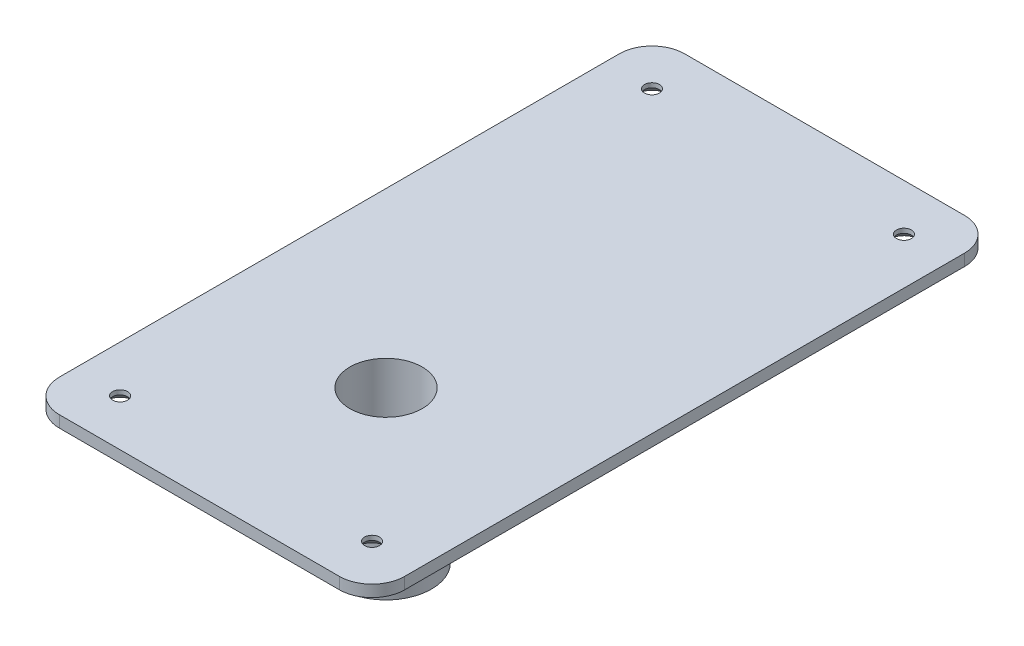
ISO-10303-21;
HEADER;
FILE_DESCRIPTION(('STEP AP214'),'2;1');
FILE_NAME('part.step','',(''),(''),'','','');
FILE_SCHEMA(('AUTOMOTIVE_DESIGN { 1 0 10303 214 1 1 1 1 }'));
ENDSEC;
DATA;
#1=APPLICATION_CONTEXT('core data for automotive mechanical design processes');
#2=APPLICATION_PROTOCOL_DEFINITION('international standard','automotive_design',2000,#1);
#3=PRODUCT_CONTEXT('',#1,'mechanical');
#4=PRODUCT('Part','Part','',(#3));
#5=PRODUCT_RELATED_PRODUCT_CATEGORY('part','',(#4));
#6=PRODUCT_DEFINITION_FORMATION('','',#4);
#7=PRODUCT_DEFINITION_CONTEXT('part definition',#1,'design');
#8=PRODUCT_DEFINITION('design','',#6,#7);
#9=PRODUCT_DEFINITION_SHAPE('','',#8);
#10=(LENGTH_UNIT() NAMED_UNIT(*) SI_UNIT(.MILLI.,.METRE.));
#11=(NAMED_UNIT(*) PLANE_ANGLE_UNIT() SI_UNIT($,.RADIAN.));
#12=(NAMED_UNIT(*) SI_UNIT($,.STERADIAN.) SOLID_ANGLE_UNIT());
#13=UNCERTAINTY_MEASURE_WITH_UNIT(LENGTH_MEASURE(1.E-05),#10,'distance_accuracy_value','');
#14=(GEOMETRIC_REPRESENTATION_CONTEXT(3) GLOBAL_UNCERTAINTY_ASSIGNED_CONTEXT((#13)) GLOBAL_UNIT_ASSIGNED_CONTEXT((#10,
#11,#12)) REPRESENTATION_CONTEXT('',''));
#15=CARTESIAN_POINT('',(0.,0.,0.));
#16=DIRECTION('',(0.,0.,1.));
#17=DIRECTION('',(1.,0.,0.));
#18=AXIS2_PLACEMENT_3D('',#15,#16,#17);
#19=CARTESIAN_POINT('',(-30.,2.5,-60.));
#20=DIRECTION('',(0.,1.,0.));
#21=DIRECTION('',(0.,0.,1.));
#22=AXIS2_PLACEMENT_3D('',#19,#20,#21);
#23=PLANE('',#22);
#24=CARTESIAN_POINT('',(-27.,2.5,57.));
#25=DIRECTION('',(0.,1.,0.));
#26=DIRECTION('',(0.,0.,1.));
#27=AXIS2_PLACEMENT_3D('',#24,#25,#26);
#28=CIRCLE('',#27,1.6);
#29=CARTESIAN_POINT('',(-27.,2.5,58.6));
#30=VERTEX_POINT('',#29);
#31=EDGE_CURVE('E268',#30,#30,#28,.F.);
#32=ORIENTED_EDGE('',*,*,#31,.T.);
#33=EDGE_LOOP('',(#32));
#34=FACE_BOUND('',#33,.T.);
#35=CARTESIAN_POINT('',(27.,2.5,-57.));
#36=DIRECTION('',(0.,1.,0.));
#37=DIRECTION('',(0.,0.,1.));
#38=AXIS2_PLACEMENT_3D('',#35,#36,#37);
#39=CIRCLE('',#38,1.6);
#40=CARTESIAN_POINT('',(27.,2.5,-55.4));
#41=VERTEX_POINT('',#40);
#42=EDGE_CURVE('E244',#41,#41,#39,.F.);
#43=ORIENTED_EDGE('',*,*,#42,.T.);
#44=EDGE_LOOP('',(#43));
#45=FACE_BOUND('',#44,.T.);
#46=CARTESIAN_POINT('',(-27.,2.5,-57.));
#47=DIRECTION('',(0.,1.,0.));
#48=DIRECTION('',(0.,0.,1.));
#49=AXIS2_PLACEMENT_3D('',#46,#47,#48);
#50=CIRCLE('',#49,1.6);
#51=CARTESIAN_POINT('',(-27.,2.5,-55.4));
#52=VERTEX_POINT('',#51);
#53=EDGE_CURVE('E231',#52,#52,#50,.F.);
#54=ORIENTED_EDGE('',*,*,#53,.T.);
#55=EDGE_LOOP('',(#54));
#56=FACE_BOUND('',#55,.T.);
#57=CARTESIAN_POINT('',(0.,2.5,27.));
#58=DIRECTION('',(0.,1.,0.));
#59=DIRECTION('',(0.,0.,1.));
#60=AXIS2_PLACEMENT_3D('',#57,#58,#59);
#61=CIRCLE('',#60,7.75);
#62=CARTESIAN_POINT('',(0.,2.5,34.75));
#63=VERTEX_POINT('',#62);
#64=EDGE_CURVE('E51',#63,#63,#61,.F.);
#65=ORIENTED_EDGE('',*,*,#64,.T.);
#66=EDGE_LOOP('',(#65));
#67=FACE_BOUND('',#66,.T.);
#68=CARTESIAN_POINT('',(-30.,2.5,-60.));
#69=DIRECTION('',(0.,1.,0.));
#70=DIRECTION('',(0.,0.,1.));
#71=AXIS2_PLACEMENT_3D('',#68,#69,#70);
#72=CIRCLE('',#71,6.99999999999999);
#73=CARTESIAN_POINT('',(-30.,2.5,-67.));
#74=VERTEX_POINT('',#73);
#75=CARTESIAN_POINT('',(-37.,2.5,-60.));
#76=VERTEX_POINT('',#75);
#77=EDGE_CURVE('E176',#74,#76,#72,.T.);
#78=ORIENTED_EDGE('',*,*,#77,.T.);
#79=DIRECTION('',(0.,0.,1.));
#80=VECTOR('',#79,1.);
#81=CARTESIAN_POINT('',(-37.,2.5,-60.));
#82=LINE('',#81,#80);
#83=CARTESIAN_POINT('',(-37.,2.5,60.));
#84=VERTEX_POINT('',#83);
#85=EDGE_CURVE('E104',#76,#84,#82,.T.);
#86=ORIENTED_EDGE('',*,*,#85,.T.);
#87=CARTESIAN_POINT('',(-30.,2.5,60.));
#88=DIRECTION('',(0.,1.,0.));
#89=DIRECTION('',(0.,0.,1.));
#90=AXIS2_PLACEMENT_3D('',#87,#88,#89);
#91=CIRCLE('',#90,7.);
#92=CARTESIAN_POINT('',(-30.,2.5,67.));
#93=VERTEX_POINT('',#92);
#94=EDGE_CURVE('E198',#84,#93,#91,.T.);
#95=ORIENTED_EDGE('',*,*,#94,.T.);
#96=DIRECTION('',(1.,0.,0.));
#97=VECTOR('',#96,1.);
#98=CARTESIAN_POINT('',(-30.,2.5,67.));
#99=LINE('',#98,#97);
#100=CARTESIAN_POINT('',(30.,2.5,67.));
#101=VERTEX_POINT('',#100);
#102=EDGE_CURVE('E210',#93,#101,#99,.T.);
#103=ORIENTED_EDGE('',*,*,#102,.T.);
#104=CARTESIAN_POINT('',(30.,2.5,60.));
#105=DIRECTION('',(0.,1.,0.));
#106=DIRECTION('',(0.,0.,1.));
#107=AXIS2_PLACEMENT_3D('',#104,#105,#106);
#108=CIRCLE('',#107,6.99999999999999);
#109=CARTESIAN_POINT('',(37.,2.5,60.));
#110=VERTEX_POINT('',#109);
#111=EDGE_CURVE('E138',#101,#110,#108,.T.);
#112=ORIENTED_EDGE('',*,*,#111,.T.);
#113=DIRECTION('',(0.,0.,1.));
#114=VECTOR('',#113,1.);
#115=CARTESIAN_POINT('',(37.,2.5,-60.));
#116=LINE('',#115,#114);
#117=CARTESIAN_POINT('',(37.,2.5,-60.));
#118=VERTEX_POINT('',#117);
#119=EDGE_CURVE('E123',#118,#110,#116,.T.);
#120=ORIENTED_EDGE('',*,*,#119,.F.);
#121=CARTESIAN_POINT('',(30.,2.5,-60.));
#122=DIRECTION('',(0.,-1.,0.));
#123=DIRECTION('',(0.,0.,-1.));
#124=AXIS2_PLACEMENT_3D('',#121,#122,#123);
#125=CIRCLE('',#124,7.);
#126=CARTESIAN_POINT('',(30.,2.5,-67.));
#127=VERTEX_POINT('',#126);
#128=EDGE_CURVE('E136',#127,#118,#125,.T.);
#129=ORIENTED_EDGE('',*,*,#128,.F.);
#130=DIRECTION('',(1.,0.,0.));
#131=VECTOR('',#130,1.);
#132=CARTESIAN_POINT('',(-30.,2.5,-67.));
#133=LINE('',#132,#131);
#134=EDGE_CURVE('E144',#74,#127,#133,.T.);
#135=ORIENTED_EDGE('',*,*,#134,.F.);
#136=EDGE_LOOP('',(#78,#86,#95,#103,#112,#120,#129,#135));
#137=FACE_BOUND('',#136,.T.);
#138=CARTESIAN_POINT('',(27.,2.5,57.));
#139=DIRECTION('',(0.,1.,0.));
#140=DIRECTION('',(0.,0.,1.));
#141=AXIS2_PLACEMENT_3D('',#138,#139,#140);
#142=CIRCLE('',#141,1.6);
#143=CARTESIAN_POINT('',(27.,2.5,58.6));
#144=VERTEX_POINT('',#143);
#145=EDGE_CURVE('E256',#144,#144,#142,.F.);
#146=ORIENTED_EDGE('',*,*,#145,.T.);
#147=EDGE_LOOP('',(#146));
#148=FACE_BOUND('',#147,.T.);
#149=ADVANCED_FACE('F47',(#34,#45,#56,#67,#137,#148),#23,.T.);
#150=CARTESIAN_POINT('',(-30.,2.5,-60.));
#151=DIRECTION('',(0.,-1.,0.));
#152=DIRECTION('',(0.,0.,-1.));
#153=AXIS2_PLACEMENT_3D('',#150,#151,#152);
#154=CYLINDRICAL_SURFACE('',#153,6.99999999999999);
#155=CARTESIAN_POINT('',(-30.,0.,-60.));
#156=DIRECTION('',(0.,1.,0.));
#157=DIRECTION('',(0.,0.,1.));
#158=AXIS2_PLACEMENT_3D('',#155,#156,#157);
#159=CIRCLE('',#158,6.99999999999999);
#160=CARTESIAN_POINT('',(-30.,0.,-67.));
#161=VERTEX_POINT('',#160);
#162=CARTESIAN_POINT('',(-37.,0.,-60.));
#163=VERTEX_POINT('',#162);
#164=EDGE_CURVE('E150',#161,#163,#159,.T.);
#165=ORIENTED_EDGE('',*,*,#164,.T.);
#166=DIRECTION('',(0.,-1.,0.));
#167=VECTOR('',#166,1.);
#168=CARTESIAN_POINT('',(-37.,2.5,-60.));
#169=LINE('',#168,#167);
#170=EDGE_CURVE('E12',#76,#163,#169,.T.);
#171=ORIENTED_EDGE('',*,*,#170,.F.);
#172=ORIENTED_EDGE('',*,*,#77,.F.);
#173=DIRECTION('',(0.,-1.,0.));
#174=VECTOR('',#173,1.);
#175=CARTESIAN_POINT('',(-30.,2.5,-67.));
#176=LINE('',#175,#174);
#177=EDGE_CURVE('E66',#74,#161,#176,.T.);
#178=ORIENTED_EDGE('',*,*,#177,.T.);
#179=EDGE_LOOP('',(#165,#171,#172,#178));
#180=FACE_BOUND('',#179,.T.);
#181=ADVANCED_FACE('F49',(#180),#154,.T.);
#182=CARTESIAN_POINT('',(-37.,2.5,-60.));
#183=DIRECTION('',(1.,0.,0.));
#184=DIRECTION('',(0.,0.,-1.));
#185=AXIS2_PLACEMENT_3D('',#182,#183,#184);
#186=PLANE('',#185);
#187=DIRECTION('',(0.,0.,1.));
#188=VECTOR('',#187,1.);
#189=CARTESIAN_POINT('',(-37.,0.,-60.));
#190=LINE('',#189,#188);
#191=CARTESIAN_POINT('',(-37.,0.,60.));
#192=VERTEX_POINT('',#191);
#193=EDGE_CURVE('E153',#163,#192,#190,.T.);
#194=ORIENTED_EDGE('',*,*,#193,.T.);
#195=DIRECTION('',(0.,-1.,0.));
#196=VECTOR('',#195,1.);
#197=CARTESIAN_POINT('',(-37.,2.5,60.));
#198=LINE('',#197,#196);
#199=EDGE_CURVE('E58',#84,#192,#198,.T.);
#200=ORIENTED_EDGE('',*,*,#199,.F.);
#201=ORIENTED_EDGE('',*,*,#85,.F.);
#202=ORIENTED_EDGE('',*,*,#170,.T.);
#203=EDGE_LOOP('',(#194,#200,#201,#202));
#204=FACE_BOUND('',#203,.T.);
#205=ADVANCED_FACE('F317',(#204),#186,.F.);
#206=CARTESIAN_POINT('',(-30.,2.5,60.));
#207=DIRECTION('',(0.,-1.,0.));
#208=DIRECTION('',(0.,0.,-1.));
#209=AXIS2_PLACEMENT_3D('',#206,#207,#208);
#210=CYLINDRICAL_SURFACE('',#209,7.);
#211=CARTESIAN_POINT('',(-30.,0.,60.));
#212=DIRECTION('',(0.,1.,0.));
#213=DIRECTION('',(0.,0.,1.));
#214=AXIS2_PLACEMENT_3D('',#211,#212,#213);
#215=CIRCLE('',#214,7.);
#216=CARTESIAN_POINT('',(-30.,0.,67.));
#217=VERTEX_POINT('',#216);
#218=EDGE_CURVE('E157',#192,#217,#215,.T.);
#219=ORIENTED_EDGE('',*,*,#218,.T.);
#220=DIRECTION('',(0.,-1.,0.));
#221=VECTOR('',#220,1.);
#222=CARTESIAN_POINT('',(-30.,2.5,67.));
#223=LINE('',#222,#221);
#224=EDGE_CURVE('E187',#93,#217,#223,.T.);
#225=ORIENTED_EDGE('',*,*,#224,.F.);
#226=ORIENTED_EDGE('',*,*,#94,.F.);
#227=ORIENTED_EDGE('',*,*,#199,.T.);
#228=EDGE_LOOP('',(#219,#225,#226,#227));
#229=FACE_BOUND('',#228,.T.);
#230=ADVANCED_FACE('F196',(#229),#210,.T.);
#231=CARTESIAN_POINT('',(-30.,2.5,67.));
#232=DIRECTION('',(0.,0.,-1.));
#233=DIRECTION('',(-1.,0.,0.));
#234=AXIS2_PLACEMENT_3D('',#231,#232,#233);
#235=PLANE('',#234);
#236=DIRECTION('',(1.,0.,0.));
#237=VECTOR('',#236,1.);
#238=CARTESIAN_POINT('',(-30.,0.,67.));
#239=LINE('',#238,#237);
#240=CARTESIAN_POINT('',(30.,0.,67.));
#241=VERTEX_POINT('',#240);
#242=EDGE_CURVE('E160',#217,#241,#239,.T.);
#243=ORIENTED_EDGE('',*,*,#242,.T.);
#244=DIRECTION('',(0.,-1.,0.));
#245=VECTOR('',#244,1.);
#246=CARTESIAN_POINT('',(30.,2.5,67.));
#247=LINE('',#246,#245);
#248=EDGE_CURVE('E183',#101,#241,#247,.T.);
#249=ORIENTED_EDGE('',*,*,#248,.F.);
#250=ORIENTED_EDGE('',*,*,#102,.F.);
#251=ORIENTED_EDGE('',*,*,#224,.T.);
#252=EDGE_LOOP('',(#243,#249,#250,#251));
#253=FACE_BOUND('',#252,.T.);
#254=ADVANCED_FACE('F205',(#253),#235,.F.);
#255=CARTESIAN_POINT('',(30.,2.5,60.));
#256=DIRECTION('',(0.,-1.,0.));
#257=DIRECTION('',(0.,0.,-1.));
#258=AXIS2_PLACEMENT_3D('',#255,#256,#257);
#259=CYLINDRICAL_SURFACE('',#258,6.99999999999999);
#260=CARTESIAN_POINT('',(30.,0.,60.));
#261=DIRECTION('',(0.,1.,0.));
#262=DIRECTION('',(0.,0.,1.));
#263=AXIS2_PLACEMENT_3D('',#260,#261,#262);
#264=CIRCLE('',#263,6.99999999999999);
#265=CARTESIAN_POINT('',(37.,0.,60.));
#266=VERTEX_POINT('',#265);
#267=EDGE_CURVE('E163',#241,#266,#264,.T.);
#268=ORIENTED_EDGE('',*,*,#267,.T.);
#269=DIRECTION('',(0.,-1.,0.));
#270=VECTOR('',#269,1.);
#271=CARTESIAN_POINT('',(37.,2.5,60.));
#272=LINE('',#271,#270);
#273=EDGE_CURVE('E130',#110,#266,#272,.T.);
#274=ORIENTED_EDGE('',*,*,#273,.F.);
#275=ORIENTED_EDGE('',*,*,#111,.F.);
#276=ORIENTED_EDGE('',*,*,#248,.T.);
#277=EDGE_LOOP('',(#268,#274,#275,#276));
#278=FACE_BOUND('',#277,.T.);
#279=ADVANCED_FACE('F208',(#278),#259,.T.);
#280=CARTESIAN_POINT('',(37.,2.5,-60.));
#281=DIRECTION('',(1.,0.,0.));
#282=DIRECTION('',(0.,0.,-1.));
#283=AXIS2_PLACEMENT_3D('',#280,#281,#282);
#284=PLANE('',#283);
#285=DIRECTION('',(0.,0.,1.));
#286=VECTOR('',#285,1.);
#287=CARTESIAN_POINT('',(37.,0.,-60.));
#288=LINE('',#287,#286);
#289=CARTESIAN_POINT('',(37.,0.,-60.));
#290=VERTEX_POINT('',#289);
#291=EDGE_CURVE('E125',#290,#266,#288,.T.);
#292=ORIENTED_EDGE('',*,*,#291,.F.);
#293=DIRECTION('',(0.,-1.,0.));
#294=VECTOR('',#293,1.);
#295=CARTESIAN_POINT('',(37.,2.5,-60.));
#296=LINE('',#295,#294);
#297=EDGE_CURVE('E120',#118,#290,#296,.T.);
#298=ORIENTED_EDGE('',*,*,#297,.F.);
#299=ORIENTED_EDGE('',*,*,#119,.T.);
#300=ORIENTED_EDGE('',*,*,#273,.T.);
#301=EDGE_LOOP('',(#292,#298,#299,#300));
#302=FACE_BOUND('',#301,.T.);
#303=ADVANCED_FACE('F122',(#302),#284,.T.);
#304=CARTESIAN_POINT('',(30.,2.5,-60.));
#305=DIRECTION('',(0.,-1.,0.));
#306=DIRECTION('',(0.,0.,-1.));
#307=AXIS2_PLACEMENT_3D('',#304,#305,#306);
#308=CYLINDRICAL_SURFACE('',#307,7.);
#309=CARTESIAN_POINT('',(30.,0.,-60.));
#310=DIRECTION('',(0.,-1.,0.));
#311=DIRECTION('',(0.,0.,-1.));
#312=AXIS2_PLACEMENT_3D('',#309,#310,#311);
#313=CIRCLE('',#312,7.);
#314=CARTESIAN_POINT('',(30.,0.,-67.));
#315=VERTEX_POINT('',#314);
#316=EDGE_CURVE('E169',#315,#290,#313,.T.);
#317=ORIENTED_EDGE('',*,*,#316,.F.);
#318=DIRECTION('',(0.,-1.,0.));
#319=VECTOR('',#318,1.);
#320=CARTESIAN_POINT('',(30.,2.5,-67.));
#321=LINE('',#320,#319);
#322=EDGE_CURVE('E92',#127,#315,#321,.T.);
#323=ORIENTED_EDGE('',*,*,#322,.F.);
#324=ORIENTED_EDGE('',*,*,#128,.T.);
#325=ORIENTED_EDGE('',*,*,#297,.T.);
#326=EDGE_LOOP('',(#317,#323,#324,#325));
#327=FACE_BOUND('',#326,.T.);
#328=ADVANCED_FACE('F142',(#327),#308,.T.);
#329=CARTESIAN_POINT('',(-30.,2.5,-67.));
#330=DIRECTION('',(0.,0.,-1.));
#331=DIRECTION('',(-1.,0.,0.));
#332=AXIS2_PLACEMENT_3D('',#329,#330,#331);
#333=PLANE('',#332);
#334=DIRECTION('',(1.,0.,0.));
#335=VECTOR('',#334,1.);
#336=CARTESIAN_POINT('',(-30.,0.,-67.));
#337=LINE('',#336,#335);
#338=EDGE_CURVE('E172',#161,#315,#337,.T.);
#339=ORIENTED_EDGE('',*,*,#338,.F.);
#340=ORIENTED_EDGE('',*,*,#177,.F.);
#341=ORIENTED_EDGE('',*,*,#134,.T.);
#342=ORIENTED_EDGE('',*,*,#322,.T.);
#343=EDGE_LOOP('',(#339,#340,#341,#342));
#344=FACE_BOUND('',#343,.T.);
#345=ADVANCED_FACE('F291',(#344),#333,.T.);
#346=CARTESIAN_POINT('',(-30.,0.,-60.));
#347=DIRECTION('',(0.,1.,0.));
#348=DIRECTION('',(0.,0.,1.));
#349=AXIS2_PLACEMENT_3D('',#346,#347,#348);
#350=PLANE('',#349);
#351=CARTESIAN_POINT('',(-27.,0.,57.));
#352=DIRECTION('',(0.,-1.,0.));
#353=DIRECTION('',(0.,0.,-1.));
#354=AXIS2_PLACEMENT_3D('',#351,#352,#353);
#355=CIRCLE('',#354,3.15);
#356=CARTESIAN_POINT('',(-27.,0.,53.85));
#357=VERTEX_POINT('',#356);
#358=EDGE_CURVE('E272',#357,#357,#355,.T.);
#359=ORIENTED_EDGE('',*,*,#358,.F.);
#360=EDGE_LOOP('',(#359));
#361=FACE_BOUND('',#360,.T.);
#362=CARTESIAN_POINT('',(27.,0.,57.));
#363=DIRECTION('',(0.,-1.,0.));
#364=DIRECTION('',(0.,0.,-1.));
#365=AXIS2_PLACEMENT_3D('',#362,#363,#364);
#366=CIRCLE('',#365,3.15);
#367=CARTESIAN_POINT('',(27.,0.,53.85));
#368=VERTEX_POINT('',#367);
#369=EDGE_CURVE('E260',#368,#368,#366,.T.);
#370=ORIENTED_EDGE('',*,*,#369,.F.);
#371=EDGE_LOOP('',(#370));
#372=FACE_BOUND('',#371,.T.);
#373=CARTESIAN_POINT('',(27.,0.,-57.));
#374=DIRECTION('',(0.,-1.,0.));
#375=DIRECTION('',(0.,0.,-1.));
#376=AXIS2_PLACEMENT_3D('',#373,#374,#375);
#377=CIRCLE('',#376,3.15);
#378=CARTESIAN_POINT('',(27.,0.,-60.15));
#379=VERTEX_POINT('',#378);
#380=EDGE_CURVE('E248',#379,#379,#377,.T.);
#381=ORIENTED_EDGE('',*,*,#380,.F.);
#382=EDGE_LOOP('',(#381));
#383=FACE_BOUND('',#382,.T.);
#384=CARTESIAN_POINT('',(-27.,0.,-57.));
#385=DIRECTION('',(0.,-1.,0.));
#386=DIRECTION('',(0.,0.,-1.));
#387=AXIS2_PLACEMENT_3D('',#384,#385,#386);
#388=CIRCLE('',#387,3.15);
#389=CARTESIAN_POINT('',(-27.,0.,-60.15));
#390=VERTEX_POINT('',#389);
#391=EDGE_CURVE('E236',#390,#390,#388,.T.);
#392=ORIENTED_EDGE('',*,*,#391,.F.);
#393=EDGE_LOOP('',(#392));
#394=FACE_BOUND('',#393,.T.);
#395=CARTESIAN_POINT('',(0.,0.,27.));
#396=DIRECTION('',(0.,1.,0.));
#397=DIRECTION('',(0.,0.,1.));
#398=AXIS2_PLACEMENT_3D('',#395,#396,#397);
#399=CIRCLE('',#398,9.75);
#400=CARTESIAN_POINT('',(0.,0.,36.75));
#401=VERTEX_POINT('',#400);
#402=EDGE_CURVE('E220',#401,#401,#399,.T.);
#403=ORIENTED_EDGE('',*,*,#402,.T.);
#404=EDGE_LOOP('',(#403));
#405=FACE_BOUND('',#404,.T.);
#406=ORIENTED_EDGE('',*,*,#164,.F.);
#407=ORIENTED_EDGE('',*,*,#338,.T.);
#408=ORIENTED_EDGE('',*,*,#316,.T.);
#409=ORIENTED_EDGE('',*,*,#291,.T.);
#410=ORIENTED_EDGE('',*,*,#267,.F.);
#411=ORIENTED_EDGE('',*,*,#242,.F.);
#412=ORIENTED_EDGE('',*,*,#218,.F.);
#413=ORIENTED_EDGE('',*,*,#193,.F.);
#414=EDGE_LOOP('',(#406,#407,#408,#409,#410,#411,#412,#413));
#415=FACE_BOUND('',#414,.T.);
#416=ADVANCED_FACE('F201',(#361,#372,#383,#394,#405,#415),#350,.F.);
#417=CARTESIAN_POINT('',(0.,-30.,27.));
#418=DIRECTION('',(0.,1.,0.));
#419=DIRECTION('',(0.,0.,1.));
#420=AXIS2_PLACEMENT_3D('',#417,#418,#419);
#421=CYLINDRICAL_SURFACE('',#420,9.75);
#422=CARTESIAN_POINT('',(0.,-30.,27.));
#423=DIRECTION('',(0.,1.,0.));
#424=DIRECTION('',(0.,0.,1.));
#425=AXIS2_PLACEMENT_3D('',#422,#423,#424);
#426=CIRCLE('',#425,9.75);
#427=CARTESIAN_POINT('',(0.,-30.,36.75));
#428=VERTEX_POINT('',#427);
#429=EDGE_CURVE('E154',#428,#428,#426,.T.);
#430=ORIENTED_EDGE('',*,*,#429,.T.);
#431=EDGE_LOOP('',(#430));
#432=FACE_BOUND('',#431,.T.);
#433=ORIENTED_EDGE('',*,*,#402,.F.);
#434=EDGE_LOOP('',(#433));
#435=FACE_BOUND('',#434,.T.);
#436=ADVANCED_FACE('F290',(#432,#435),#421,.T.);
#437=CARTESIAN_POINT('',(0.,-30.,27.));
#438=DIRECTION('',(0.,1.,0.));
#439=DIRECTION('',(0.,0.,1.));
#440=AXIS2_PLACEMENT_3D('',#437,#438,#439);
#441=PLANE('',#440);
#442=CARTESIAN_POINT('',(0.,-30.,27.));
#443=DIRECTION('',(0.,1.,0.));
#444=DIRECTION('',(0.,0.,1.));
#445=AXIS2_PLACEMENT_3D('',#442,#443,#444);
#446=CIRCLE('',#445,7.75);
#447=CARTESIAN_POINT('',(0.,-30.,34.75));
#448=VERTEX_POINT('',#447);
#449=EDGE_CURVE('E224',#448,#448,#446,.T.);
#450=ORIENTED_EDGE('',*,*,#449,.T.);
#451=EDGE_LOOP('',(#450));
#452=FACE_BOUND('',#451,.T.);
#453=ORIENTED_EDGE('',*,*,#429,.F.);
#454=EDGE_LOOP('',(#453));
#455=FACE_BOUND('',#454,.T.);
#456=ADVANCED_FACE('F302',(#452,#455),#441,.F.);
#457=CARTESIAN_POINT('',(0.,-30.,27.));
#458=DIRECTION('',(0.,1.,0.));
#459=DIRECTION('',(0.,0.,1.));
#460=AXIS2_PLACEMENT_3D('',#457,#458,#459);
#461=CYLINDRICAL_SURFACE('',#460,7.75);
#462=ORIENTED_EDGE('',*,*,#449,.F.);
#463=EDGE_LOOP('',(#462));
#464=FACE_BOUND('',#463,.T.);
#465=ORIENTED_EDGE('',*,*,#64,.F.);
#466=EDGE_LOOP('',(#465));
#467=FACE_BOUND('',#466,.T.);
#468=ADVANCED_FACE('F308',(#464,#467),#461,.F.);
#469=CARTESIAN_POINT('',(-27.,0.,-57.));
#470=DIRECTION('',(0.,-1.,0.));
#471=DIRECTION('',(0.,0.,-1.));
#472=AXIS2_PLACEMENT_3D('',#469,#470,#471);
#473=CYLINDRICAL_SURFACE('',#472,1.6);
#474=ORIENTED_EDGE('',*,*,#53,.F.);
#475=EDGE_LOOP('',(#474));
#476=FACE_BOUND('',#475,.T.);
#477=CARTESIAN_POINT('',(-27.,1.55,-57.));
#478=DIRECTION('',(0.,-1.,0.));
#479=DIRECTION('',(0.,0.,-1.));
#480=AXIS2_PLACEMENT_3D('',#477,#478,#479);
#481=CIRCLE('',#480,1.6);
#482=CARTESIAN_POINT('',(-27.,1.55,-58.6));
#483=VERTEX_POINT('',#482);
#484=EDGE_CURVE('E235',#483,#483,#481,.T.);
#485=ORIENTED_EDGE('',*,*,#484,.T.);
#486=EDGE_LOOP('',(#485));
#487=FACE_BOUND('',#486,.T.);
#488=ADVANCED_FACE('F374',(#476,#487),#473,.F.);
#489=CARTESIAN_POINT('',(-27.,0.,-57.));
#490=DIRECTION('',(0.,-1.,0.));
#491=DIRECTION('',(0.,0.,-1.));
#492=AXIS2_PLACEMENT_3D('',#489,#490,#491);
#493=CONICAL_SURFACE('',#492,3.15,0.785398163397449);
#494=ORIENTED_EDGE('',*,*,#484,.F.);
#495=EDGE_LOOP('',(#494));
#496=FACE_BOUND('',#495,.T.);
#497=ORIENTED_EDGE('',*,*,#391,.T.);
#498=EDGE_LOOP('',(#497));
#499=FACE_BOUND('',#498,.T.);
#500=ADVANCED_FACE('F379',(#496,#499),#493,.F.);
#501=CARTESIAN_POINT('',(27.,0.,-57.));
#502=DIRECTION('',(0.,-1.,0.));
#503=DIRECTION('',(0.,0.,-1.));
#504=AXIS2_PLACEMENT_3D('',#501,#502,#503);
#505=CYLINDRICAL_SURFACE('',#504,1.6);
#506=ORIENTED_EDGE('',*,*,#42,.F.);
#507=EDGE_LOOP('',(#506));
#508=FACE_BOUND('',#507,.T.);
#509=CARTESIAN_POINT('',(27.,1.55,-57.));
#510=DIRECTION('',(0.,-1.,0.));
#511=DIRECTION('',(0.,0.,-1.));
#512=AXIS2_PLACEMENT_3D('',#509,#510,#511);
#513=CIRCLE('',#512,1.6);
#514=CARTESIAN_POINT('',(27.,1.55,-58.6));
#515=VERTEX_POINT('',#514);
#516=EDGE_CURVE('E240',#515,#515,#513,.T.);
#517=ORIENTED_EDGE('',*,*,#516,.T.);
#518=EDGE_LOOP('',(#517));
#519=FACE_BOUND('',#518,.T.);
#520=ADVANCED_FACE('F390',(#508,#519),#505,.F.);
#521=CARTESIAN_POINT('',(27.,0.,-57.));
#522=DIRECTION('',(0.,-1.,0.));
#523=DIRECTION('',(0.,0.,-1.));
#524=AXIS2_PLACEMENT_3D('',#521,#522,#523);
#525=CONICAL_SURFACE('',#524,3.15,0.785398163397449);
#526=ORIENTED_EDGE('',*,*,#516,.F.);
#527=EDGE_LOOP('',(#526));
#528=FACE_BOUND('',#527,.T.);
#529=ORIENTED_EDGE('',*,*,#380,.T.);
#530=EDGE_LOOP('',(#529));
#531=FACE_BOUND('',#530,.T.);
#532=ADVANCED_FACE('F400',(#528,#531),#525,.F.);
#533=CARTESIAN_POINT('',(27.,0.,57.));
#534=DIRECTION('',(0.,-1.,0.));
#535=DIRECTION('',(0.,0.,-1.));
#536=AXIS2_PLACEMENT_3D('',#533,#534,#535);
#537=CYLINDRICAL_SURFACE('',#536,1.6);
#538=ORIENTED_EDGE('',*,*,#145,.F.);
#539=EDGE_LOOP('',(#538));
#540=FACE_BOUND('',#539,.T.);
#541=CARTESIAN_POINT('',(27.,1.55,57.));
#542=DIRECTION('',(0.,-1.,0.));
#543=DIRECTION('',(0.,0.,-1.));
#544=AXIS2_PLACEMENT_3D('',#541,#542,#543);
#545=CIRCLE('',#544,1.6);
#546=CARTESIAN_POINT('',(27.,1.55,55.4));
#547=VERTEX_POINT('',#546);
#548=EDGE_CURVE('E252',#547,#547,#545,.T.);
#549=ORIENTED_EDGE('',*,*,#548,.T.);
#550=EDGE_LOOP('',(#549));
#551=FACE_BOUND('',#550,.T.);
#552=ADVANCED_FACE('F410',(#540,#551),#537,.F.);
#553=CARTESIAN_POINT('',(27.,0.,57.));
#554=DIRECTION('',(0.,-1.,0.));
#555=DIRECTION('',(0.,0.,-1.));
#556=AXIS2_PLACEMENT_3D('',#553,#554,#555);
#557=CONICAL_SURFACE('',#556,3.15,0.785398163397449);
#558=ORIENTED_EDGE('',*,*,#548,.F.);
#559=EDGE_LOOP('',(#558));
#560=FACE_BOUND('',#559,.T.);
#561=ORIENTED_EDGE('',*,*,#369,.T.);
#562=EDGE_LOOP('',(#561));
#563=FACE_BOUND('',#562,.T.);
#564=ADVANCED_FACE('F420',(#560,#563),#557,.F.);
#565=CARTESIAN_POINT('',(-27.,0.,57.));
#566=DIRECTION('',(0.,-1.,0.));
#567=DIRECTION('',(0.,0.,-1.));
#568=AXIS2_PLACEMENT_3D('',#565,#566,#567);
#569=CYLINDRICAL_SURFACE('',#568,1.6);
#570=ORIENTED_EDGE('',*,*,#31,.F.);
#571=EDGE_LOOP('',(#570));
#572=FACE_BOUND('',#571,.T.);
#573=CARTESIAN_POINT('',(-27.,1.55,57.));
#574=DIRECTION('',(0.,-1.,0.));
#575=DIRECTION('',(0.,0.,-1.));
#576=AXIS2_PLACEMENT_3D('',#573,#574,#575);
#577=CIRCLE('',#576,1.6);
#578=CARTESIAN_POINT('',(-27.,1.55,55.4));
#579=VERTEX_POINT('',#578);
#580=EDGE_CURVE('E264',#579,#579,#577,.T.);
#581=ORIENTED_EDGE('',*,*,#580,.T.);
#582=EDGE_LOOP('',(#581));
#583=FACE_BOUND('',#582,.T.);
#584=ADVANCED_FACE('F280',(#572,#583),#569,.F.);
#585=CARTESIAN_POINT('',(-27.,0.,57.));
#586=DIRECTION('',(0.,-1.,0.));
#587=DIRECTION('',(0.,0.,-1.));
#588=AXIS2_PLACEMENT_3D('',#585,#586,#587);
#589=CONICAL_SURFACE('',#588,3.15,0.785398163397449);
#590=ORIENTED_EDGE('',*,*,#580,.F.);
#591=EDGE_LOOP('',(#590));
#592=FACE_BOUND('',#591,.T.);
#593=ORIENTED_EDGE('',*,*,#358,.T.);
#594=EDGE_LOOP('',(#593));
#595=FACE_BOUND('',#594,.T.);
#596=ADVANCED_FACE('F282',(#592,#595),#589,.F.);
#597=CLOSED_SHELL('',(#149,#181,#205,#230,#254,#279,#303,#328,#345,#416,#436,#456,#468,#488,
#500,#520,#532,#552,#564,#584,#596));
#598=MANIFOLD_SOLID_BREP('B2',#597);
#599=ADVANCED_BREP_SHAPE_REPRESENTATION('',(#18,#598),#14);
#600=SHAPE_DEFINITION_REPRESENTATION(#9,#599);
ENDSEC;
END-ISO-10303-21;
